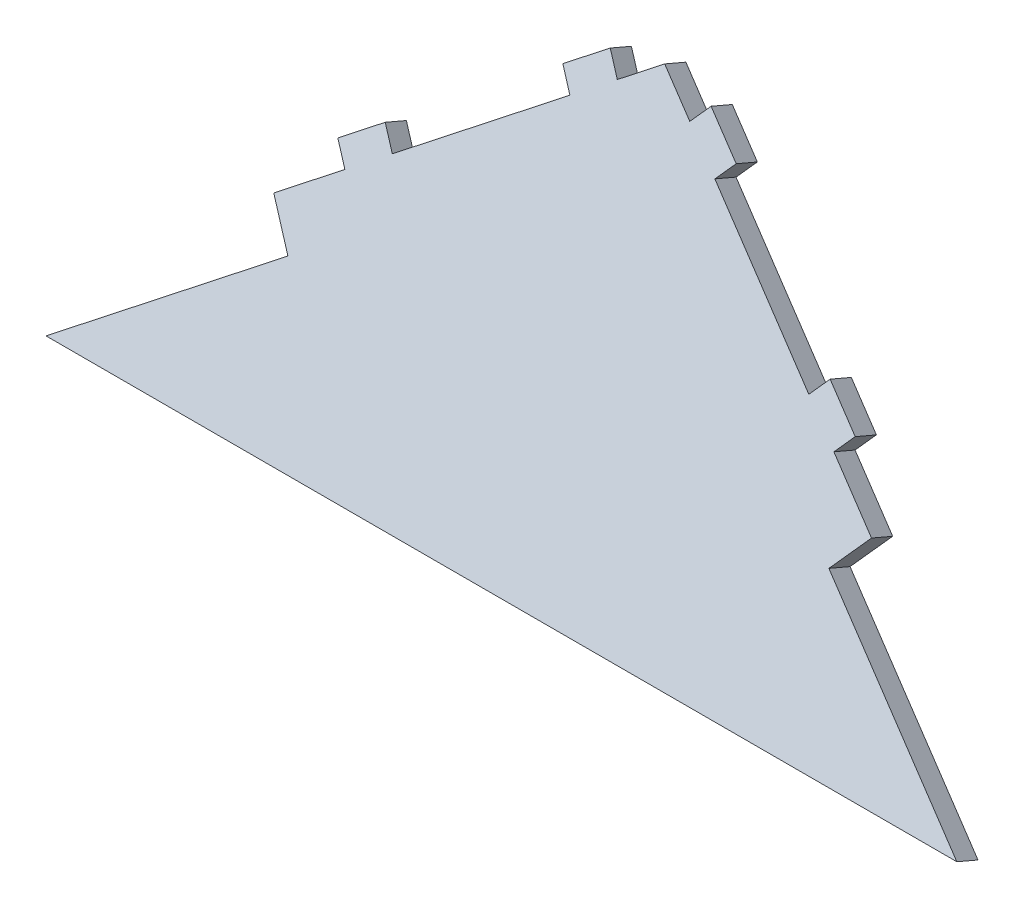
ISO-10303-21;
HEADER;
FILE_DESCRIPTION(('STEP AP214'),'2;1');
FILE_NAME('part.step','',(''),(''),'','','');
FILE_SCHEMA(('AUTOMOTIVE_DESIGN { 1 0 10303 214 1 1 1 1 }'));
ENDSEC;
DATA;
#1=APPLICATION_CONTEXT('core data for automotive mechanical design processes');
#2=APPLICATION_PROTOCOL_DEFINITION('international standard','automotive_design',2000,#1);
#3=PRODUCT_CONTEXT('',#1,'mechanical');
#4=PRODUCT('Part','Part','',(#3));
#5=PRODUCT_RELATED_PRODUCT_CATEGORY('part','',(#4));
#6=PRODUCT_DEFINITION_FORMATION('','',#4);
#7=PRODUCT_DEFINITION_CONTEXT('part definition',#1,'design');
#8=PRODUCT_DEFINITION('design','',#6,#7);
#9=PRODUCT_DEFINITION_SHAPE('','',#8);
#10=(LENGTH_UNIT() NAMED_UNIT(*) SI_UNIT(.MILLI.,.METRE.));
#11=(NAMED_UNIT(*) PLANE_ANGLE_UNIT() SI_UNIT($,.RADIAN.));
#12=(NAMED_UNIT(*) SI_UNIT($,.STERADIAN.) SOLID_ANGLE_UNIT());
#13=UNCERTAINTY_MEASURE_WITH_UNIT(LENGTH_MEASURE(1.E-05),#10,'distance_accuracy_value','');
#14=(GEOMETRIC_REPRESENTATION_CONTEXT(3) GLOBAL_UNCERTAINTY_ASSIGNED_CONTEXT((#13)) GLOBAL_UNIT_ASSIGNED_CONTEXT((#10,
#11,#12)) REPRESENTATION_CONTEXT('',''));
#15=CARTESIAN_POINT('',(0.,0.,0.));
#16=DIRECTION('',(0.,0.,1.));
#17=DIRECTION('',(1.,0.,0.));
#18=AXIS2_PLACEMENT_3D('',#15,#16,#17);
#19=CARTESIAN_POINT('',(0.,-9.20052588435921,-21.5016166865018));
#20=DIRECTION('',(0.,-0.393397156897278,-0.919368629519813));
#21=DIRECTION('',(0.,0.919368629519813,-0.393397156897278));
#22=AXIS2_PLACEMENT_3D('',#19,#20,#21);
#23=PLANE('',#22);
#24=DIRECTION('',(-0.787342411916439,-0.566805431330575,0.242535625036334));
#25=VECTOR('',#24,1.);
#26=CARTESIAN_POINT('',(-53.1157823784544,-40.2048775655227,-8.23487752314398));
#27=LINE('',#26,#25);
#28=CARTESIAN_POINT('',(-53.1157823784544,-40.2048775655227,-8.23487752314398));
#29=VERTEX_POINT('',#28);
#30=CARTESIAN_POINT('',(-64.9259185572009,-48.7069590354813,-4.59684314759898));
#31=VERTEX_POINT('',#30);
#32=EDGE_CURVE('E43',#29,#31,#27,.T.);
#33=ORIENTED_EDGE('',*,*,#32,.F.);
#34=DIRECTION('',(0.616515957942376,-0.723857914206439,0.309738266352574));
#35=VECTOR('',#34,1.);
#36=CARTESIAN_POINT('',(-53.1157823784544,-40.2048775655227,-8.23487752314398));
#37=LINE('',#36,#35);
#38=CARTESIAN_POINT('',(-56.1983621681663,-36.5855879944905,-9.78356885490686));
#39=VERTEX_POINT('',#38);
#40=EDGE_CURVE('E64',#39,#29,#37,.T.);
#41=ORIENTED_EDGE('',*,*,#40,.F.);
#42=DIRECTION('',(-0.787342411916438,-0.566805431330575,0.242535625036339));
#43=VECTOR('',#42,1.);
#44=CARTESIAN_POINT('',(-48.3249380490019,-30.9175336811847,-12.2089251052702));
#45=LINE('',#44,#43);
#46=CARTESIAN_POINT('',(-48.3249380490019,-30.9175336811847,-12.2089251052702));
#47=VERTEX_POINT('',#46);
#48=EDGE_CURVE('E73',#47,#39,#45,.T.);
#49=ORIENTED_EDGE('',*,*,#48,.F.);
#50=DIRECTION('',(-0.616515957942375,0.723857914206439,-0.309738266352574));
#51=VECTOR('',#50,1.);
#52=CARTESIAN_POINT('',(-48.3249380490019,-30.9175336811847,-12.2089251052702));
#53=LINE('',#52,#51);
#54=CARTESIAN_POINT('',(-45.24235825929,-34.5368232522169,-10.6602337735074));
#55=VERTEX_POINT('',#54);
#56=EDGE_CURVE('E80',#55,#47,#53,.T.);
#57=ORIENTED_EDGE('',*,*,#56,.F.);
#58=DIRECTION('',(-0.787342411916439,-0.566805431330577,0.24253562503633));
#59=VECTOR('',#58,1.);
#60=CARTESIAN_POINT('',(-15.7468482383288,-13.3030944110979,-19.7461306468723));
#61=LINE('',#60,#59);
#62=CARTESIAN_POINT('',(-15.7468482383288,-13.3030944110979,-19.7461306468723));
#63=VERTEX_POINT('',#62);
#64=EDGE_CURVE('E88',#63,#55,#61,.T.);
#65=ORIENTED_EDGE('',*,*,#64,.F.);
#66=DIRECTION('',(0.616515957942375,-0.72385791420644,0.309738266352575));
#67=VECTOR('',#66,1.);
#68=CARTESIAN_POINT('',(-18.8294280280407,-9.68380484006569,-21.2948219786352));
#69=LINE('',#68,#67);
#70=CARTESIAN_POINT('',(-18.8294280280407,-9.68380484006569,-21.2948219786352));
#71=VERTEX_POINT('',#70);
#72=EDGE_CURVE('E460',#71,#63,#69,.T.);
#73=ORIENTED_EDGE('',*,*,#72,.F.);
#74=DIRECTION('',(-0.787342411916439,-0.566805431330572,0.242535625036344));
#75=VECTOR('',#74,1.);
#76=CARTESIAN_POINT('',(-10.9560039088763,-4.01575052675998,-23.7201782289986));
#77=LINE('',#76,#75);
#78=CARTESIAN_POINT('',(-10.9560039088763,-4.01575052675998,-23.7201782289986));
#79=VERTEX_POINT('',#78);
#80=EDGE_CURVE('E446',#79,#71,#77,.T.);
#81=ORIENTED_EDGE('',*,*,#80,.F.);
#82=DIRECTION('',(-0.616515957942376,0.723857914206439,-0.309738266352575));
#83=VECTOR('',#82,1.);
#84=CARTESIAN_POINT('',(-7.87342411916439,-7.63504009779217,-22.1714868972357));
#85=LINE('',#84,#83);
#86=CARTESIAN_POINT('',(-7.87342411916439,-7.63504009779217,-22.1714868972357));
#87=VERTEX_POINT('',#86);
#88=EDGE_CURVE('E432',#87,#79,#85,.T.);
#89=ORIENTED_EDGE('',*,*,#88,.F.);
#90=DIRECTION('',(-0.787342411916439,-0.566805431330576,0.242535625036332));
#91=VECTOR('',#90,1.);
#92=CARTESIAN_POINT('',(0.,-1.96698578448641,-24.5968431475991));
#93=LINE('',#92,#91);
#94=CARTESIAN_POINT('',(0.,-1.96698578448641,-24.5968431475991));
#95=VERTEX_POINT('',#94);
#96=EDGE_CURVE('E418',#95,#87,#93,.T.);
#97=ORIENTED_EDGE('',*,*,#96,.F.);
#98=DIRECTION('',(-0.787342411916441,0.566805431330572,-0.242535625036335));
#99=VECTOR('',#98,1.);
#100=CARTESIAN_POINT('',(0.,-1.96698578448641,-24.5968431475991));
#101=LINE('',#100,#99);
#102=CARTESIAN_POINT('',(7.87342411916441,-7.63504009779213,-22.1714868972357));
#103=VERTEX_POINT('',#102);
#104=EDGE_CURVE('E404',#103,#95,#101,.T.);
#105=ORIENTED_EDGE('',*,*,#104,.F.);
#106=DIRECTION('',(-0.616515957942376,-0.723857914206438,0.309738266352575));
#107=VECTOR('',#106,1.);
#108=CARTESIAN_POINT('',(10.9560039088763,-4.01575052675994,-23.7201782289986));
#109=LINE('',#108,#107);
#110=CARTESIAN_POINT('',(10.9560039088763,-4.01575052675994,-23.7201782289986));
#111=VERTEX_POINT('',#110);
#112=EDGE_CURVE('E390',#111,#103,#109,.T.);
#113=ORIENTED_EDGE('',*,*,#112,.F.);
#114=DIRECTION('',(-0.787342411916439,0.566805431330576,-0.242535625036334));
#115=VECTOR('',#114,1.);
#116=CARTESIAN_POINT('',(18.8294280280407,-9.6838048400657,-21.2948219786352));
#117=LINE('',#116,#115);
#118=CARTESIAN_POINT('',(18.8294280280407,-9.6838048400657,-21.2948219786352));
#119=VERTEX_POINT('',#118);
#120=EDGE_CURVE('E376',#119,#111,#117,.T.);
#121=ORIENTED_EDGE('',*,*,#120,.F.);
#122=DIRECTION('',(0.616515957942376,0.723857914206438,-0.309738266352575));
#123=VECTOR('',#122,1.);
#124=CARTESIAN_POINT('',(15.7468482383288,-13.3030944110979,-19.7461306468724));
#125=LINE('',#124,#123);
#126=CARTESIAN_POINT('',(15.7468482383288,-13.3030944110979,-19.7461306468724));
#127=VERTEX_POINT('',#126);
#128=EDGE_CURVE('E362',#127,#119,#125,.T.);
#129=ORIENTED_EDGE('',*,*,#128,.F.);
#130=DIRECTION('',(-0.787342411916443,0.566805431330569,-0.242535625036335));
#131=VECTOR('',#130,1.);
#132=CARTESIAN_POINT('',(15.7468482383288,-13.3030944110979,-19.7461306468724));
#133=LINE('',#132,#131);
#134=CARTESIAN_POINT('',(45.2423582592895,-34.5368232522161,-10.6602337735075));
#135=VERTEX_POINT('',#134);
#136=EDGE_CURVE('E348',#135,#127,#133,.T.);
#137=ORIENTED_EDGE('',*,*,#136,.F.);
#138=DIRECTION('',(-0.616515957942372,-0.723857914206409,0.309738266352652));
#139=VECTOR('',#138,1.);
#140=CARTESIAN_POINT('',(48.3249380490013,-30.9175336811841,-12.2089251052707));
#141=LINE('',#140,#139);
#142=CARTESIAN_POINT('',(48.3249380490013,-30.9175336811841,-12.2089251052708));
#143=VERTEX_POINT('',#142);
#144=EDGE_CURVE('E334',#143,#135,#141,.T.);
#145=ORIENTED_EDGE('',*,*,#144,.F.);
#146=DIRECTION('',(-0.787342411916445,0.566805431330569,-0.242535625036328));
#147=VECTOR('',#146,1.);
#148=CARTESIAN_POINT('',(48.3249380490013,-30.9175336811841,-12.2089251052707));
#149=LINE('',#148,#147);
#150=CARTESIAN_POINT('',(56.1983621681658,-36.5855879944897,-9.78356885490747));
#151=VERTEX_POINT('',#150);
#152=EDGE_CURVE('E320',#151,#143,#149,.T.);
#153=ORIENTED_EDGE('',*,*,#152,.F.);
#154=DIRECTION('',(0.616515957942369,0.723857914206406,-0.309738266352663));
#155=VECTOR('',#154,1.);
#156=CARTESIAN_POINT('',(53.1157823784539,-40.2048775655218,-8.23487752314416));
#157=LINE('',#156,#155);
#158=CARTESIAN_POINT('',(53.1157823784539,-40.2048775655218,-8.23487752314416));
#159=VERTEX_POINT('',#158);
#160=EDGE_CURVE('E306',#159,#151,#157,.T.);
#161=ORIENTED_EDGE('',*,*,#160,.F.);
#162=DIRECTION('',(-0.787342411916422,0.5668054313306,-0.242535625036331));
#163=VECTOR('',#162,1.);
#164=CARTESIAN_POINT('',(53.1157823784539,-40.2048775655218,-8.23487752314416));
#165=LINE('',#164,#163);
#166=CARTESIAN_POINT('',(64.9259185572009,-48.7069590354813,-4.59684314759899));
#167=VERTEX_POINT('',#166);
#168=EDGE_CURVE('E292',#167,#159,#165,.T.);
#169=ORIENTED_EDGE('',*,*,#168,.F.);
#170=DIRECTION('',(0.616515957942376,0.723857914206438,-0.309738266352575));
#171=VECTOR('',#170,1.);
#172=CARTESIAN_POINT('',(64.9259185572009,-48.7069590354813,-4.59684314759899));
#173=LINE('',#172,#171);
#174=CARTESIAN_POINT('',(58.7607589777772,-55.9455381775457,-1.49946048407323));
#175=VERTEX_POINT('',#174);
#176=EDGE_CURVE('E278',#175,#167,#173,.T.);
#177=ORIENTED_EDGE('',*,*,#176,.F.);
#178=DIRECTION('',(-0.787342411916438,0.566805431330576,-0.242535625036335));
#179=VECTOR('',#178,1.);
#180=CARTESIAN_POINT('',(58.7607589777772,-55.9455381775457,-1.49946048407323));
#181=LINE('',#180,#179);
#182=CARTESIAN_POINT('',(98.9352155895367,-84.867008510731,10.876015290325));
#183=VERTEX_POINT('',#182);
#184=EDGE_CURVE('E264',#183,#175,#181,.T.);
#185=ORIENTED_EDGE('',*,*,#184,.F.);
#186=DIRECTION('',(1.,0.,0.));
#187=VECTOR('',#186,1.);
#188=CARTESIAN_POINT('',(98.9352155895367,-84.867008510731,10.876015290325));
#189=LINE('',#188,#187);
#190=CARTESIAN_POINT('',(-98.9352155895367,-84.867008510731,10.876015290325));
#191=VERTEX_POINT('',#190);
#192=EDGE_CURVE('E250',#191,#183,#189,.T.);
#193=ORIENTED_EDGE('',*,*,#192,.F.);
#194=DIRECTION('',(-0.787342411916438,-0.566805431330577,0.242535625036334));
#195=VECTOR('',#194,1.);
#196=CARTESIAN_POINT('',(-58.7607589777772,-55.9455381775457,-1.49946048407323));
#197=LINE('',#196,#195);
#198=CARTESIAN_POINT('',(-58.7607589777772,-55.9455381775457,-1.49946048407323));
#199=VERTEX_POINT('',#198);
#200=EDGE_CURVE('E227',#199,#191,#197,.T.);
#201=ORIENTED_EDGE('',*,*,#200,.F.);
#202=DIRECTION('',(0.616515957942377,-0.723857914206438,0.309738266352575));
#203=VECTOR('',#202,1.);
#204=CARTESIAN_POINT('',(-64.9259185572009,-48.7069590354813,-4.59684314759898));
#205=LINE('',#204,#203);
#206=EDGE_CURVE('E221',#31,#199,#205,.T.);
#207=ORIENTED_EDGE('',*,*,#206,.F.);
#208=EDGE_LOOP('',(#33,#41,#49,#57,#65,#73,#81,#89,#97,#105,#113,#121,#129,#137,#145,#153,#161,
#169,#177,#185,#193,#201,#207));
#209=FACE_BOUND('',#208,.T.);
#210=ADVANCED_FACE('F34',(#209),#23,.T.);
#211=CARTESIAN_POINT('',(0.,-7.2335400998728,-16.9047735389027));
#212=DIRECTION('',(0.,-0.393397156897278,-0.919368629519813));
#213=DIRECTION('',(0.,0.919368629519813,-0.393397156897278));
#214=AXIS2_PLACEMENT_3D('',#211,#212,#213);
#215=PLANE('',#214);
#216=DIRECTION('',(-0.787342411916439,-0.566805431330575,0.242535625036334));
#217=VECTOR('',#216,1.);
#218=CARTESIAN_POINT('',(-53.1157823784544,-38.2378917810362,-3.63803437554493));
#219=LINE('',#218,#217);
#220=CARTESIAN_POINT('',(-53.1157823784544,-38.2378917810362,-3.63803437554493));
#221=VERTEX_POINT('',#220);
#222=CARTESIAN_POINT('',(-64.9259185572009,-46.7399732509949,0.));
#223=VERTEX_POINT('',#222);
#224=EDGE_CURVE('E12',#221,#223,#219,.T.);
#225=ORIENTED_EDGE('',*,*,#224,.T.);
#226=DIRECTION('',(0.616515957942377,-0.723857914206438,0.309738266352575));
#227=VECTOR('',#226,1.);
#228=CARTESIAN_POINT('',(-64.9259185572009,-46.7399732509949,0.));
#229=LINE('',#228,#227);
#230=CARTESIAN_POINT('',(-58.7607589777772,-53.9785523930592,3.09738266352582));
#231=VERTEX_POINT('',#230);
#232=EDGE_CURVE('E216',#223,#231,#229,.T.);
#233=ORIENTED_EDGE('',*,*,#232,.T.);
#234=DIRECTION('',(-0.787342411916438,-0.566805431330577,0.242535625036334));
#235=VECTOR('',#234,1.);
#236=CARTESIAN_POINT('',(-58.7607589777772,-53.9785523930592,3.09738266352582));
#237=LINE('',#236,#235);
#238=CARTESIAN_POINT('',(-98.9352155895367,-82.9000227262446,15.4728584379241));
#239=VERTEX_POINT('',#238);
#240=EDGE_CURVE('E228',#231,#239,#237,.T.);
#241=ORIENTED_EDGE('',*,*,#240,.T.);
#242=DIRECTION('',(1.,0.,0.));
#243=VECTOR('',#242,1.);
#244=CARTESIAN_POINT('',(98.9352155895367,-82.9000227262446,15.4728584379241));
#245=LINE('',#244,#243);
#246=CARTESIAN_POINT('',(98.9352155895367,-82.9000227262446,15.4728584379241));
#247=VERTEX_POINT('',#246);
#248=EDGE_CURVE('E244',#239,#247,#245,.T.);
#249=ORIENTED_EDGE('',*,*,#248,.T.);
#250=DIRECTION('',(-0.787342411916438,0.566805431330576,-0.242535625036335));
#251=VECTOR('',#250,1.);
#252=CARTESIAN_POINT('',(58.7607589777772,-53.9785523930592,3.09738266352582));
#253=LINE('',#252,#251);
#254=CARTESIAN_POINT('',(58.7607589777772,-53.9785523930592,3.09738266352582));
#255=VERTEX_POINT('',#254);
#256=EDGE_CURVE('E258',#247,#255,#253,.T.);
#257=ORIENTED_EDGE('',*,*,#256,.T.);
#258=DIRECTION('',(0.616515957942376,0.723857914206438,-0.309738266352575));
#259=VECTOR('',#258,1.);
#260=CARTESIAN_POINT('',(64.9259185572009,-46.7399732509949,0.));
#261=LINE('',#260,#259);
#262=CARTESIAN_POINT('',(64.9259185572009,-46.7399732509949,0.));
#263=VERTEX_POINT('',#262);
#264=EDGE_CURVE('E272',#255,#263,#261,.T.);
#265=ORIENTED_EDGE('',*,*,#264,.T.);
#266=DIRECTION('',(-0.787342411916422,0.5668054313306,-0.242535625036331));
#267=VECTOR('',#266,1.);
#268=CARTESIAN_POINT('',(53.1157823784539,-38.2378917810354,-3.6380343755451));
#269=LINE('',#268,#267);
#270=CARTESIAN_POINT('',(53.1157823784539,-38.2378917810354,-3.6380343755451));
#271=VERTEX_POINT('',#270);
#272=EDGE_CURVE('E286',#263,#271,#269,.T.);
#273=ORIENTED_EDGE('',*,*,#272,.T.);
#274=DIRECTION('',(0.616515957942369,0.723857914206406,-0.309738266352663));
#275=VECTOR('',#274,1.);
#276=CARTESIAN_POINT('',(53.1157823784539,-38.2378917810354,-3.6380343755451));
#277=LINE('',#276,#275);
#278=CARTESIAN_POINT('',(56.1983621681658,-34.6186022100033,-5.18672570730842));
#279=VERTEX_POINT('',#278);
#280=EDGE_CURVE('E300',#271,#279,#277,.T.);
#281=ORIENTED_EDGE('',*,*,#280,.T.);
#282=DIRECTION('',(-0.787342411916445,0.566805431330569,-0.242535625036328));
#283=VECTOR('',#282,1.);
#284=CARTESIAN_POINT('',(48.3249380490013,-28.9505478966976,-7.61208195767169));
#285=LINE('',#284,#283);
#286=CARTESIAN_POINT('',(48.3249380490013,-28.9505478966976,-7.61208195767169));
#287=VERTEX_POINT('',#286);
#288=EDGE_CURVE('E314',#279,#287,#285,.T.);
#289=ORIENTED_EDGE('',*,*,#288,.T.);
#290=DIRECTION('',(-0.616515957942372,-0.723857914206409,0.309738266352652));
#291=VECTOR('',#290,1.);
#292=CARTESIAN_POINT('',(48.3249380490013,-28.9505478966976,-7.61208195767169));
#293=LINE('',#292,#291);
#294=CARTESIAN_POINT('',(45.2423582592895,-32.5698374677297,-6.06339062590843));
#295=VERTEX_POINT('',#294);
#296=EDGE_CURVE('E328',#287,#295,#293,.T.);
#297=ORIENTED_EDGE('',*,*,#296,.T.);
#298=DIRECTION('',(-0.787342411916443,0.566805431330569,-0.242535625036335));
#299=VECTOR('',#298,1.);
#300=CARTESIAN_POINT('',(15.7468482383288,-11.3361086266115,-15.1492874992733));
#301=LINE('',#300,#299);
#302=CARTESIAN_POINT('',(15.7468482383288,-11.3361086266115,-15.1492874992733));
#303=VERTEX_POINT('',#302);
#304=EDGE_CURVE('E342',#295,#303,#301,.T.);
#305=ORIENTED_EDGE('',*,*,#304,.T.);
#306=DIRECTION('',(0.616515957942376,0.723857914206438,-0.309738266352575));
#307=VECTOR('',#306,1.);
#308=CARTESIAN_POINT('',(15.7468482383288,-11.3361086266115,-15.1492874992733));
#309=LINE('',#308,#307);
#310=CARTESIAN_POINT('',(18.8294280280407,-7.71681905557928,-16.6979788310362));
#311=VERTEX_POINT('',#310);
#312=EDGE_CURVE('E356',#303,#311,#309,.T.);
#313=ORIENTED_EDGE('',*,*,#312,.T.);
#314=DIRECTION('',(-0.787342411916439,0.566805431330576,-0.242535625036334));
#315=VECTOR('',#314,1.);
#316=CARTESIAN_POINT('',(18.8294280280407,-7.71681905557928,-16.6979788310362));
#317=LINE('',#316,#315);
#318=CARTESIAN_POINT('',(10.9560039088763,-2.04876474227353,-19.1233350813995));
#319=VERTEX_POINT('',#318);
#320=EDGE_CURVE('E370',#311,#319,#317,.T.);
#321=ORIENTED_EDGE('',*,*,#320,.T.);
#322=DIRECTION('',(-0.616515957942376,-0.723857914206438,0.309738266352575));
#323=VECTOR('',#322,1.);
#324=CARTESIAN_POINT('',(10.9560039088763,-2.04876474227353,-19.1233350813995));
#325=LINE('',#324,#323);
#326=CARTESIAN_POINT('',(7.87342411916441,-5.66805431330572,-17.5746437496367));
#327=VERTEX_POINT('',#326);
#328=EDGE_CURVE('E384',#319,#327,#325,.T.);
#329=ORIENTED_EDGE('',*,*,#328,.T.);
#330=DIRECTION('',(-0.787342411916441,0.566805431330572,-0.242535625036335));
#331=VECTOR('',#330,1.);
#332=CARTESIAN_POINT('',(0.,0.,-20.));
#333=LINE('',#332,#331);
#334=CARTESIAN_POINT('',(0.,0.,-20.));
#335=VERTEX_POINT('',#334);
#336=EDGE_CURVE('E398',#327,#335,#333,.T.);
#337=ORIENTED_EDGE('',*,*,#336,.T.);
#338=DIRECTION('',(-0.787342411916439,-0.566805431330576,0.242535625036332));
#339=VECTOR('',#338,1.);
#340=CARTESIAN_POINT('',(0.,0.,-20.));
#341=LINE('',#340,#339);
#342=CARTESIAN_POINT('',(-7.87342411916439,-5.66805431330576,-17.5746437496367));
#343=VERTEX_POINT('',#342);
#344=EDGE_CURVE('E412',#335,#343,#341,.T.);
#345=ORIENTED_EDGE('',*,*,#344,.T.);
#346=DIRECTION('',(-0.616515957942376,0.723857914206439,-0.309738266352575));
#347=VECTOR('',#346,1.);
#348=CARTESIAN_POINT('',(-7.87342411916439,-5.66805431330576,-17.5746437496367));
#349=LINE('',#348,#347);
#350=CARTESIAN_POINT('',(-10.9560039088763,-2.04876474227357,-19.1233350813996));
#351=VERTEX_POINT('',#350);
#352=EDGE_CURVE('E426',#343,#351,#349,.T.);
#353=ORIENTED_EDGE('',*,*,#352,.T.);
#354=DIRECTION('',(-0.787342411916439,-0.566805431330572,0.242535625036344));
#355=VECTOR('',#354,1.);
#356=CARTESIAN_POINT('',(-10.9560039088763,-2.04876474227357,-19.1233350813996));
#357=LINE('',#356,#355);
#358=CARTESIAN_POINT('',(-18.8294280280407,-7.71681905557928,-16.6979788310361));
#359=VERTEX_POINT('',#358);
#360=EDGE_CURVE('E440',#351,#359,#357,.T.);
#361=ORIENTED_EDGE('',*,*,#360,.T.);
#362=DIRECTION('',(0.616515957942375,-0.72385791420644,0.309738266352575));
#363=VECTOR('',#362,1.);
#364=CARTESIAN_POINT('',(-18.8294280280407,-7.71681905557928,-16.6979788310361));
#365=LINE('',#364,#363);
#366=CARTESIAN_POINT('',(-15.7468482383288,-11.3361086266115,-15.1492874992732));
#367=VERTEX_POINT('',#366);
#368=EDGE_CURVE('E454',#359,#367,#365,.T.);
#369=ORIENTED_EDGE('',*,*,#368,.T.);
#370=DIRECTION('',(-0.787342411916439,-0.566805431330577,0.24253562503633));
#371=VECTOR('',#370,1.);
#372=CARTESIAN_POINT('',(-15.7468482383288,-11.3361086266115,-15.1492874992732));
#373=LINE('',#372,#371);
#374=CARTESIAN_POINT('',(-45.24235825929,-32.5698374677305,-6.06339062590832));
#375=VERTEX_POINT('',#374);
#376=EDGE_CURVE('E105',#367,#375,#373,.T.);
#377=ORIENTED_EDGE('',*,*,#376,.T.);
#378=DIRECTION('',(-0.616515957942375,0.723857914206439,-0.309738266352574));
#379=VECTOR('',#378,1.);
#380=CARTESIAN_POINT('',(-48.3249380490019,-28.9505478966983,-7.61208195767119));
#381=LINE('',#380,#379);
#382=CARTESIAN_POINT('',(-48.3249380490019,-28.9505478966983,-7.61208195767119));
#383=VERTEX_POINT('',#382);
#384=EDGE_CURVE('E100',#375,#383,#381,.T.);
#385=ORIENTED_EDGE('',*,*,#384,.T.);
#386=DIRECTION('',(-0.787342411916438,-0.566805431330575,0.242535625036339));
#387=VECTOR('',#386,1.);
#388=CARTESIAN_POINT('',(-48.3249380490019,-28.9505478966983,-7.61208195767119));
#389=LINE('',#388,#387);
#390=CARTESIAN_POINT('',(-56.1983621681663,-34.618602210004,-5.1867257073078));
#391=VERTEX_POINT('',#390);
#392=EDGE_CURVE('E96',#383,#391,#389,.T.);
#393=ORIENTED_EDGE('',*,*,#392,.T.);
#394=DIRECTION('',(0.616515957942376,-0.723857914206439,0.309738266352574));
#395=VECTOR('',#394,1.);
#396=CARTESIAN_POINT('',(-53.1157823784544,-38.2378917810362,-3.63803437554493));
#397=LINE('',#396,#395);
#398=EDGE_CURVE('E500',#391,#221,#397,.T.);
#399=ORIENTED_EDGE('',*,*,#398,.T.);
#400=EDGE_LOOP('',(#225,#233,#241,#249,#257,#265,#273,#281,#289,#297,#305,#313,#321,#329,#337,
#345,#353,#361,#369,#377,#385,#393,#399));
#401=FACE_BOUND('',#400,.T.);
#402=ADVANCED_FACE('F519',(#401),#215,.F.);
#403=CARTESIAN_POINT('',(-53.1157823784544,-38.2378917810362,-3.63803437554493));
#404=DIRECTION('',(0.787342411916439,0.566805431330575,-0.242535625036335));
#405=DIRECTION('',(-0.584249665637435,0.811573981965012,0.));
#406=AXIS2_PLACEMENT_3D('',#403,#404,#405);
#407=PLANE('',#406);
#408=ORIENTED_EDGE('',*,*,#40,.T.);
#409=DIRECTION('',(0.,-0.393397156897282,-0.919368629519811));
#410=VECTOR('',#409,1.);
#411=CARTESIAN_POINT('',(-53.1157823784544,-38.2378917810362,-3.63803437554493));
#412=LINE('',#411,#410);
#413=EDGE_CURVE('E213',#221,#29,#412,.T.);
#414=ORIENTED_EDGE('',*,*,#413,.F.);
#415=ORIENTED_EDGE('',*,*,#398,.F.);
#416=DIRECTION('',(0.,-0.393397156897282,-0.919368629519811));
#417=VECTOR('',#416,1.);
#418=CARTESIAN_POINT('',(-56.1983621681663,-34.618602210004,-5.1867257073078));
#419=LINE('',#418,#417);
#420=EDGE_CURVE('E499',#391,#39,#419,.T.);
#421=ORIENTED_EDGE('',*,*,#420,.T.);
#422=EDGE_LOOP('',(#408,#414,#415,#421));
#423=FACE_BOUND('',#422,.T.);
#424=ADVANCED_FACE('F520',(#423),#407,.F.);
#425=CARTESIAN_POINT('',(-48.3249380490019,-28.9505478966983,-7.61208195767119));
#426=DIRECTION('',(0.616515957942377,-0.723857914206438,0.309738266352575));
#427=DIRECTION('',(0.76129709033642,0.648403223500085,0.));
#428=AXIS2_PLACEMENT_3D('',#425,#426,#427);
#429=PLANE('',#428);
#430=ORIENTED_EDGE('',*,*,#48,.T.);
#431=ORIENTED_EDGE('',*,*,#420,.F.);
#432=ORIENTED_EDGE('',*,*,#392,.F.);
#433=DIRECTION('',(0.,-0.393397156897282,-0.919368629519811));
#434=VECTOR('',#433,1.);
#435=CARTESIAN_POINT('',(-48.3249380490019,-28.9505478966983,-7.61208195767119));
#436=LINE('',#435,#434);
#437=EDGE_CURVE('E490',#383,#47,#436,.T.);
#438=ORIENTED_EDGE('',*,*,#437,.T.);
#439=EDGE_LOOP('',(#430,#431,#432,#438));
#440=FACE_BOUND('',#439,.T.);
#441=ADVANCED_FACE('F521',(#440),#429,.F.);
#442=CARTESIAN_POINT('',(-48.3249380490019,-28.9505478966983,-7.61208195767119));
#443=DIRECTION('',(-0.787342411916439,-0.566805431330575,0.242535625036335));
#444=DIRECTION('',(0.584249665637435,-0.811573981965012,0.));
#445=AXIS2_PLACEMENT_3D('',#442,#443,#444);
#446=PLANE('',#445);
#447=ORIENTED_EDGE('',*,*,#56,.T.);
#448=ORIENTED_EDGE('',*,*,#437,.F.);
#449=ORIENTED_EDGE('',*,*,#384,.F.);
#450=DIRECTION('',(0.,-0.393397156897282,-0.919368629519811));
#451=VECTOR('',#450,1.);
#452=CARTESIAN_POINT('',(-45.24235825929,-32.5698374677305,-6.06339062590832));
#453=LINE('',#452,#451);
#454=EDGE_CURVE('E480',#375,#55,#453,.T.);
#455=ORIENTED_EDGE('',*,*,#454,.T.);
#456=EDGE_LOOP('',(#447,#448,#449,#455));
#457=FACE_BOUND('',#456,.T.);
#458=ADVANCED_FACE('F523',(#457),#446,.F.);
#459=CARTESIAN_POINT('',(-15.7468482383288,-11.3361086266115,-15.1492874992732));
#460=DIRECTION('',(0.616515957942375,-0.723857914206439,0.309738266352576));
#461=DIRECTION('',(0.761297090336421,0.648403223500083,0.));
#462=AXIS2_PLACEMENT_3D('',#459,#460,#461);
#463=PLANE('',#462);
#464=ORIENTED_EDGE('',*,*,#64,.T.);
#465=ORIENTED_EDGE('',*,*,#454,.F.);
#466=ORIENTED_EDGE('',*,*,#376,.F.);
#467=DIRECTION('',(0.,-0.393397156897282,-0.919368629519811));
#468=VECTOR('',#467,1.);
#469=CARTESIAN_POINT('',(-15.7468482383288,-11.3361086266115,-15.1492874992732));
#470=LINE('',#469,#468);
#471=EDGE_CURVE('E470',#367,#63,#470,.T.);
#472=ORIENTED_EDGE('',*,*,#471,.T.);
#473=EDGE_LOOP('',(#464,#465,#466,#472));
#474=FACE_BOUND('',#473,.T.);
#475=ADVANCED_FACE('F529',(#474),#463,.F.);
#476=CARTESIAN_POINT('',(-18.8294280280407,-7.71681905557928,-16.6979788310361));
#477=DIRECTION('',(0.787342411916439,0.566805431330575,-0.242535625036335));
#478=DIRECTION('',(-0.584249665637434,0.811573981965012,0.));
#479=AXIS2_PLACEMENT_3D('',#476,#477,#478);
#480=PLANE('',#479);
#481=ORIENTED_EDGE('',*,*,#72,.T.);
#482=ORIENTED_EDGE('',*,*,#471,.F.);
#483=ORIENTED_EDGE('',*,*,#368,.F.);
#484=DIRECTION('',(0.,-0.393397156897282,-0.919368629519811));
#485=VECTOR('',#484,1.);
#486=CARTESIAN_POINT('',(-18.8294280280407,-7.71681905557928,-16.6979788310361));
#487=LINE('',#486,#485);
#488=EDGE_CURVE('E457',#359,#71,#487,.T.);
#489=ORIENTED_EDGE('',*,*,#488,.T.);
#490=EDGE_LOOP('',(#481,#482,#483,#489));
#491=FACE_BOUND('',#490,.T.);
#492=ADVANCED_FACE('F575',(#491),#480,.F.);
#493=CARTESIAN_POINT('',(-10.9560039088763,-2.04876474227357,-19.1233350813996));
#494=DIRECTION('',(0.616515957942376,-0.723857914206439,0.309738266352576));
#495=DIRECTION('',(0.761297090336421,0.648403223500084,0.));
#496=AXIS2_PLACEMENT_3D('',#493,#494,#495);
#497=PLANE('',#496);
#498=ORIENTED_EDGE('',*,*,#80,.T.);
#499=ORIENTED_EDGE('',*,*,#488,.F.);
#500=ORIENTED_EDGE('',*,*,#360,.F.);
#501=DIRECTION('',(0.,-0.393397156897282,-0.919368629519811));
#502=VECTOR('',#501,1.);
#503=CARTESIAN_POINT('',(-10.9560039088763,-2.04876474227357,-19.1233350813996));
#504=LINE('',#503,#502);
#505=EDGE_CURVE('E443',#351,#79,#504,.T.);
#506=ORIENTED_EDGE('',*,*,#505,.T.);
#507=EDGE_LOOP('',(#498,#499,#500,#506));
#508=FACE_BOUND('',#507,.T.);
#509=ADVANCED_FACE('F584',(#508),#497,.F.);
#510=CARTESIAN_POINT('',(-7.87342411916439,-5.66805431330576,-17.5746437496367));
#511=DIRECTION('',(-0.787342411916438,-0.566805431330576,0.242535625036335));
#512=DIRECTION('',(0.584249665637435,-0.811573981965012,0.));
#513=AXIS2_PLACEMENT_3D('',#510,#511,#512);
#514=PLANE('',#513);
#515=ORIENTED_EDGE('',*,*,#88,.T.);
#516=ORIENTED_EDGE('',*,*,#505,.F.);
#517=ORIENTED_EDGE('',*,*,#352,.F.);
#518=DIRECTION('',(0.,-0.393397156897282,-0.919368629519811));
#519=VECTOR('',#518,1.);
#520=CARTESIAN_POINT('',(-7.87342411916439,-5.66805431330576,-17.5746437496367));
#521=LINE('',#520,#519);
#522=EDGE_CURVE('E429',#343,#87,#521,.T.);
#523=ORIENTED_EDGE('',*,*,#522,.T.);
#524=EDGE_LOOP('',(#515,#516,#517,#523));
#525=FACE_BOUND('',#524,.T.);
#526=ADVANCED_FACE('F594',(#525),#514,.F.);
#527=CARTESIAN_POINT('',(0.,0.,-20.));
#528=DIRECTION('',(0.616515957942376,-0.723857914206439,0.309738266352576));
#529=DIRECTION('',(0.761297090336421,0.648403223500084,0.));
#530=AXIS2_PLACEMENT_3D('',#527,#528,#529);
#531=PLANE('',#530);
#532=ORIENTED_EDGE('',*,*,#96,.T.);
#533=ORIENTED_EDGE('',*,*,#522,.F.);
#534=ORIENTED_EDGE('',*,*,#344,.F.);
#535=DIRECTION('',(0.,-0.393397156897282,-0.919368629519811));
#536=VECTOR('',#535,1.);
#537=CARTESIAN_POINT('',(0.,0.,-20.));
#538=LINE('',#537,#536);
#539=EDGE_CURVE('E415',#335,#95,#538,.T.);
#540=ORIENTED_EDGE('',*,*,#539,.T.);
#541=EDGE_LOOP('',(#532,#533,#534,#540));
#542=FACE_BOUND('',#541,.T.);
#543=ADVANCED_FACE('F604',(#542),#531,.F.);
#544=CARTESIAN_POINT('',(0.,0.,-20.));
#545=DIRECTION('',(-0.616515957942372,-0.723857914206441,0.309738266352577));
#546=DIRECTION('',(0.761297090336424,-0.648403223500081,0.));
#547=AXIS2_PLACEMENT_3D('',#544,#545,#546);
#548=PLANE('',#547);
#549=ORIENTED_EDGE('',*,*,#104,.T.);
#550=ORIENTED_EDGE('',*,*,#539,.F.);
#551=ORIENTED_EDGE('',*,*,#336,.F.);
#552=DIRECTION('',(0.,-0.393397156897282,-0.919368629519811));
#553=VECTOR('',#552,1.);
#554=CARTESIAN_POINT('',(7.87342411916441,-5.66805431330572,-17.5746437496367));
#555=LINE('',#554,#553);
#556=EDGE_CURVE('E401',#327,#103,#555,.T.);
#557=ORIENTED_EDGE('',*,*,#556,.T.);
#558=EDGE_LOOP('',(#549,#550,#551,#557));
#559=FACE_BOUND('',#558,.T.);
#560=ADVANCED_FACE('F614',(#559),#548,.F.);
#561=CARTESIAN_POINT('',(10.9560039088763,-2.04876474227353,-19.1233350813995));
#562=DIRECTION('',(0.787342411916438,-0.566805431330576,0.242535625036335));
#563=DIRECTION('',(0.584249665637436,0.811573981965011,0.));
#564=AXIS2_PLACEMENT_3D('',#561,#562,#563);
#565=PLANE('',#564);
#566=ORIENTED_EDGE('',*,*,#112,.T.);
#567=ORIENTED_EDGE('',*,*,#556,.F.);
#568=ORIENTED_EDGE('',*,*,#328,.F.);
#569=DIRECTION('',(0.,-0.393397156897282,-0.919368629519811));
#570=VECTOR('',#569,1.);
#571=CARTESIAN_POINT('',(10.9560039088763,-2.04876474227353,-19.1233350813995));
#572=LINE('',#571,#570);
#573=EDGE_CURVE('E387',#319,#111,#572,.T.);
#574=ORIENTED_EDGE('',*,*,#573,.T.);
#575=EDGE_LOOP('',(#566,#567,#568,#574));
#576=FACE_BOUND('',#575,.T.);
#577=ADVANCED_FACE('F624',(#576),#565,.F.);
#578=CARTESIAN_POINT('',(18.8294280280407,-7.71681905557928,-16.6979788310362));
#579=DIRECTION('',(-0.616515957942376,-0.723857914206439,0.309738266352576));
#580=DIRECTION('',(0.761297090336421,-0.648403223500084,0.));
#581=AXIS2_PLACEMENT_3D('',#578,#579,#580);
#582=PLANE('',#581);
#583=ORIENTED_EDGE('',*,*,#120,.T.);
#584=ORIENTED_EDGE('',*,*,#573,.F.);
#585=ORIENTED_EDGE('',*,*,#320,.F.);
#586=DIRECTION('',(0.,-0.393397156897282,-0.919368629519811));
#587=VECTOR('',#586,1.);
#588=CARTESIAN_POINT('',(18.8294280280407,-7.71681905557928,-16.6979788310362));
#589=LINE('',#588,#587);
#590=EDGE_CURVE('E373',#311,#119,#589,.T.);
#591=ORIENTED_EDGE('',*,*,#590,.T.);
#592=EDGE_LOOP('',(#583,#584,#585,#591));
#593=FACE_BOUND('',#592,.T.);
#594=ADVANCED_FACE('F634',(#593),#582,.F.);
#595=CARTESIAN_POINT('',(15.7468482383288,-11.3361086266115,-15.1492874992733));
#596=DIRECTION('',(-0.787342411916438,0.566805431330576,-0.242535625036335));
#597=DIRECTION('',(-0.584249665637436,-0.811573981965011,0.));
#598=AXIS2_PLACEMENT_3D('',#595,#596,#597);
#599=PLANE('',#598);
#600=ORIENTED_EDGE('',*,*,#128,.T.);
#601=ORIENTED_EDGE('',*,*,#590,.F.);
#602=ORIENTED_EDGE('',*,*,#312,.F.);
#603=DIRECTION('',(0.,-0.393397156897282,-0.919368629519811));
#604=VECTOR('',#603,1.);
#605=CARTESIAN_POINT('',(15.7468482383288,-11.3361086266115,-15.1492874992733));
#606=LINE('',#605,#604);
#607=EDGE_CURVE('E359',#303,#127,#606,.T.);
#608=ORIENTED_EDGE('',*,*,#607,.T.);
#609=EDGE_LOOP('',(#600,#601,#602,#608));
#610=FACE_BOUND('',#609,.T.);
#611=ADVANCED_FACE('F644',(#610),#599,.F.);
#612=CARTESIAN_POINT('',(15.7468482383288,-11.3361086266115,-15.1492874992733));
#613=DIRECTION('',(-0.61651595794237,-0.723857914206443,0.309738266352577));
#614=DIRECTION('',(0.761297090336426,-0.648403223500078,0.));
#615=AXIS2_PLACEMENT_3D('',#612,#613,#614);
#616=PLANE('',#615);
#617=ORIENTED_EDGE('',*,*,#136,.T.);
#618=ORIENTED_EDGE('',*,*,#607,.F.);
#619=ORIENTED_EDGE('',*,*,#304,.F.);
#620=DIRECTION('',(0.,-0.393397156897282,-0.919368629519811));
#621=VECTOR('',#620,1.);
#622=CARTESIAN_POINT('',(45.2423582592895,-32.5698374677297,-6.06339062590843));
#623=LINE('',#622,#621);
#624=EDGE_CURVE('E345',#295,#135,#623,.T.);
#625=ORIENTED_EDGE('',*,*,#624,.T.);
#626=EDGE_LOOP('',(#617,#618,#619,#625));
#627=FACE_BOUND('',#626,.T.);
#628=ADVANCED_FACE('F654',(#627),#616,.F.);
#629=CARTESIAN_POINT('',(48.3249380490013,-28.9505478966976,-7.61208195767169));
#630=DIRECTION('',(0.787342411916441,-0.566805431330572,0.242535625036333));
#631=DIRECTION('',(0.584249665637431,0.811573981965015,0.));
#632=AXIS2_PLACEMENT_3D('',#629,#630,#631);
#633=PLANE('',#632);
#634=ORIENTED_EDGE('',*,*,#144,.T.);
#635=ORIENTED_EDGE('',*,*,#624,.F.);
#636=ORIENTED_EDGE('',*,*,#296,.F.);
#637=DIRECTION('',(0.,-0.393397156897282,-0.919368629519811));
#638=VECTOR('',#637,1.);
#639=CARTESIAN_POINT('',(48.3249380490013,-28.9505478966976,-7.61208195767169));
#640=LINE('',#639,#638);
#641=EDGE_CURVE('E331',#287,#143,#640,.T.);
#642=ORIENTED_EDGE('',*,*,#641,.T.);
#643=EDGE_LOOP('',(#634,#635,#636,#642));
#644=FACE_BOUND('',#643,.T.);
#645=ADVANCED_FACE('F664',(#644),#633,.F.);
#646=CARTESIAN_POINT('',(48.3249380490013,-28.9505478966976,-7.61208195767169));
#647=DIRECTION('',(-0.616515957942367,-0.723857914206445,0.309738266352578));
#648=DIRECTION('',(0.761297090336428,-0.648403223500075,0.));
#649=AXIS2_PLACEMENT_3D('',#646,#647,#648);
#650=PLANE('',#649);
#651=ORIENTED_EDGE('',*,*,#152,.T.);
#652=ORIENTED_EDGE('',*,*,#641,.F.);
#653=ORIENTED_EDGE('',*,*,#288,.F.);
#654=DIRECTION('',(0.,-0.393397156897282,-0.919368629519811));
#655=VECTOR('',#654,1.);
#656=CARTESIAN_POINT('',(56.1983621681658,-34.6186022100033,-5.18672570730842));
#657=LINE('',#656,#655);
#658=EDGE_CURVE('E317',#279,#151,#657,.T.);
#659=ORIENTED_EDGE('',*,*,#658,.T.);
#660=EDGE_LOOP('',(#651,#652,#653,#659));
#661=FACE_BOUND('',#660,.T.);
#662=ADVANCED_FACE('F674',(#661),#650,.F.);
#663=CARTESIAN_POINT('',(53.1157823784539,-38.2378917810354,-3.6380343755451));
#664=DIRECTION('',(-0.787342411916443,0.566805431330569,-0.242535625036332));
#665=DIRECTION('',(-0.584249665637429,-0.811573981965016,0.));
#666=AXIS2_PLACEMENT_3D('',#663,#664,#665);
#667=PLANE('',#666);
#668=ORIENTED_EDGE('',*,*,#160,.T.);
#669=ORIENTED_EDGE('',*,*,#658,.F.);
#670=ORIENTED_EDGE('',*,*,#280,.F.);
#671=DIRECTION('',(0.,-0.393397156897282,-0.919368629519811));
#672=VECTOR('',#671,1.);
#673=CARTESIAN_POINT('',(53.1157823784539,-38.2378917810354,-3.6380343755451));
#674=LINE('',#673,#672);
#675=EDGE_CURVE('E303',#271,#159,#674,.T.);
#676=ORIENTED_EDGE('',*,*,#675,.T.);
#677=EDGE_LOOP('',(#668,#669,#670,#676));
#678=FACE_BOUND('',#677,.T.);
#679=ADVANCED_FACE('F684',(#678),#667,.F.);
#680=CARTESIAN_POINT('',(53.1157823784539,-38.2378917810354,-3.6380343755451));
#681=DIRECTION('',(-0.616515957942397,-0.723857914206423,0.309738266352569));
#682=DIRECTION('',(0.761297090336403,-0.648403223500105,0.));
#683=AXIS2_PLACEMENT_3D('',#680,#681,#682);
#684=PLANE('',#683);
#685=ORIENTED_EDGE('',*,*,#168,.T.);
#686=ORIENTED_EDGE('',*,*,#675,.F.);
#687=ORIENTED_EDGE('',*,*,#272,.F.);
#688=DIRECTION('',(0.,-0.393397156897282,-0.919368629519811));
#689=VECTOR('',#688,1.);
#690=CARTESIAN_POINT('',(64.9259185572009,-46.7399732509949,0.));
#691=LINE('',#690,#689);
#692=EDGE_CURVE('E289',#263,#167,#691,.T.);
#693=ORIENTED_EDGE('',*,*,#692,.T.);
#694=EDGE_LOOP('',(#685,#686,#687,#693));
#695=FACE_BOUND('',#694,.T.);
#696=ADVANCED_FACE('F694',(#695),#684,.F.);
#697=CARTESIAN_POINT('',(64.9259185572009,-46.7399732509949,0.));
#698=DIRECTION('',(-0.787342411916438,0.566805431330576,-0.242535625036335));
#699=DIRECTION('',(-0.584249665637436,-0.811573981965011,0.));
#700=AXIS2_PLACEMENT_3D('',#697,#698,#699);
#701=PLANE('',#700);
#702=ORIENTED_EDGE('',*,*,#176,.T.);
#703=ORIENTED_EDGE('',*,*,#692,.F.);
#704=ORIENTED_EDGE('',*,*,#264,.F.);
#705=DIRECTION('',(0.,-0.393397156897282,-0.919368629519811));
#706=VECTOR('',#705,1.);
#707=CARTESIAN_POINT('',(58.7607589777772,-53.9785523930592,3.09738266352582));
#708=LINE('',#707,#706);
#709=EDGE_CURVE('E275',#255,#175,#708,.T.);
#710=ORIENTED_EDGE('',*,*,#709,.T.);
#711=EDGE_LOOP('',(#702,#703,#704,#710));
#712=FACE_BOUND('',#711,.T.);
#713=ADVANCED_FACE('F704',(#712),#701,.F.);
#714=CARTESIAN_POINT('',(58.7607589777772,-53.9785523930592,3.09738266352582));
#715=DIRECTION('',(-0.616515957942376,-0.723857914206438,0.309738266352575));
#716=DIRECTION('',(0.76129709033642,-0.648403223500085,0.));
#717=AXIS2_PLACEMENT_3D('',#714,#715,#716);
#718=PLANE('',#717);
#719=ORIENTED_EDGE('',*,*,#184,.T.);
#720=ORIENTED_EDGE('',*,*,#709,.F.);
#721=ORIENTED_EDGE('',*,*,#256,.F.);
#722=DIRECTION('',(0.,-0.393397156897282,-0.919368629519811));
#723=VECTOR('',#722,1.);
#724=CARTESIAN_POINT('',(98.9352155895367,-82.9000227262446,15.4728584379241));
#725=LINE('',#724,#723);
#726=EDGE_CURVE('E261',#247,#183,#725,.T.);
#727=ORIENTED_EDGE('',*,*,#726,.T.);
#728=EDGE_LOOP('',(#719,#720,#721,#727));
#729=FACE_BOUND('',#728,.T.);
#730=ADVANCED_FACE('F714',(#729),#718,.F.);
#731=CARTESIAN_POINT('',(98.9352155895367,-82.9000227262446,15.4728584379241));
#732=DIRECTION('',(0.,0.919368629519811,-0.393397156897282));
#733=DIRECTION('',(0.,0.393397156897282,0.919368629519811));
#734=AXIS2_PLACEMENT_3D('',#731,#732,#733);
#735=PLANE('',#734);
#736=ORIENTED_EDGE('',*,*,#192,.T.);
#737=ORIENTED_EDGE('',*,*,#726,.F.);
#738=ORIENTED_EDGE('',*,*,#248,.F.);
#739=DIRECTION('',(0.,-0.393397156897282,-0.919368629519811));
#740=VECTOR('',#739,1.);
#741=CARTESIAN_POINT('',(-98.9352155895367,-82.9000227262446,15.4728584379241));
#742=LINE('',#741,#740);
#743=EDGE_CURVE('E247',#239,#191,#742,.T.);
#744=ORIENTED_EDGE('',*,*,#743,.T.);
#745=EDGE_LOOP('',(#736,#737,#738,#744));
#746=FACE_BOUND('',#745,.T.);
#747=ADVANCED_FACE('F724',(#746),#735,.F.);
#748=CARTESIAN_POINT('',(-58.7607589777772,-53.9785523930592,3.09738266352582));
#749=DIRECTION('',(0.616515957942377,-0.723857914206438,0.309738266352575));
#750=DIRECTION('',(0.76129709033642,0.648403223500085,0.));
#751=AXIS2_PLACEMENT_3D('',#748,#749,#750);
#752=PLANE('',#751);
#753=ORIENTED_EDGE('',*,*,#200,.T.);
#754=ORIENTED_EDGE('',*,*,#743,.F.);
#755=ORIENTED_EDGE('',*,*,#240,.F.);
#756=DIRECTION('',(0.,-0.393397156897282,-0.919368629519811));
#757=VECTOR('',#756,1.);
#758=CARTESIAN_POINT('',(-58.7607589777772,-53.9785523930592,3.09738266352582));
#759=LINE('',#758,#757);
#760=EDGE_CURVE('E231',#231,#199,#759,.T.);
#761=ORIENTED_EDGE('',*,*,#760,.T.);
#762=EDGE_LOOP('',(#753,#754,#755,#761));
#763=FACE_BOUND('',#762,.T.);
#764=ADVANCED_FACE('F537',(#763),#752,.F.);
#765=CARTESIAN_POINT('',(-64.9259185572009,-46.7399732509949,0.));
#766=DIRECTION('',(0.787342411916438,0.566805431330576,-0.242535625036335));
#767=DIRECTION('',(-0.584249665637436,0.811573981965011,0.));
#768=AXIS2_PLACEMENT_3D('',#765,#766,#767);
#769=PLANE('',#768);
#770=ORIENTED_EDGE('',*,*,#206,.T.);
#771=ORIENTED_EDGE('',*,*,#760,.F.);
#772=ORIENTED_EDGE('',*,*,#232,.F.);
#773=DIRECTION('',(0.,-0.393397156897282,-0.919368629519811));
#774=VECTOR('',#773,1.);
#775=CARTESIAN_POINT('',(-64.9259185572009,-46.7399732509949,0.));
#776=LINE('',#775,#774);
#777=EDGE_CURVE('E212',#223,#31,#776,.T.);
#778=ORIENTED_EDGE('',*,*,#777,.T.);
#779=EDGE_LOOP('',(#770,#771,#772,#778));
#780=FACE_BOUND('',#779,.T.);
#781=ADVANCED_FACE('F219',(#780),#769,.F.);
#782=CARTESIAN_POINT('',(-53.1157823784544,-38.2378917810362,-3.63803437554493));
#783=DIRECTION('',(0.616515957942375,-0.723857914206439,0.309738266352576));
#784=DIRECTION('',(0.761297090336421,0.648403223500083,0.));
#785=AXIS2_PLACEMENT_3D('',#782,#783,#784);
#786=PLANE('',#785);
#787=ORIENTED_EDGE('',*,*,#32,.T.);
#788=ORIENTED_EDGE('',*,*,#777,.F.);
#789=ORIENTED_EDGE('',*,*,#224,.F.);
#790=ORIENTED_EDGE('',*,*,#413,.T.);
#791=EDGE_LOOP('',(#787,#788,#789,#790));
#792=FACE_BOUND('',#791,.T.);
#793=ADVANCED_FACE('F211',(#792),#786,.F.);
#794=CLOSED_SHELL('',(#210,#402,#424,#441,#458,#475,#492,#509,#526,#543,#560,#577,#594,#611,
#628,#645,#662,#679,#696,#713,#730,#747,#764,#781,#793));
#795=MANIFOLD_SOLID_BREP('B2',#794);
#796=ADVANCED_BREP_SHAPE_REPRESENTATION('',(#18,#795),#14);
#797=SHAPE_DEFINITION_REPRESENTATION(#9,#796);
ENDSEC;
END-ISO-10303-21;
